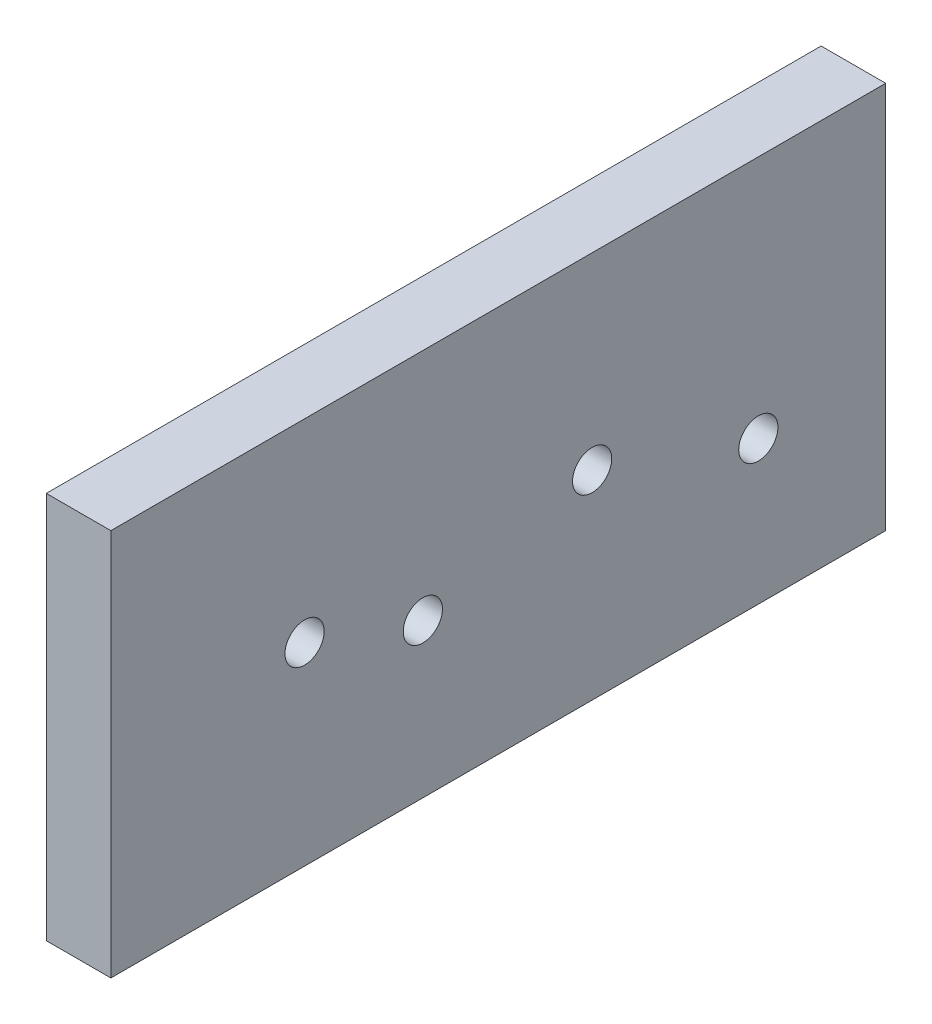
ISO-10303-21;
HEADER;
FILE_DESCRIPTION(('STEP AP214'),'2;1');
FILE_NAME('part.step','',(''),(''),'','','');
FILE_SCHEMA(('AUTOMOTIVE_DESIGN { 1 0 10303 214 1 1 1 1 }'));
ENDSEC;
DATA;
#1=APPLICATION_CONTEXT('core data for automotive mechanical design processes');
#2=APPLICATION_PROTOCOL_DEFINITION('international standard','automotive_design',2000,#1);
#3=PRODUCT_CONTEXT('',#1,'mechanical');
#4=PRODUCT('Part','Part','',(#3));
#5=PRODUCT_RELATED_PRODUCT_CATEGORY('part','',(#4));
#6=PRODUCT_DEFINITION_FORMATION('','',#4);
#7=PRODUCT_DEFINITION_CONTEXT('part definition',#1,'design');
#8=PRODUCT_DEFINITION('design','',#6,#7);
#9=PRODUCT_DEFINITION_SHAPE('','',#8);
#10=(LENGTH_UNIT() NAMED_UNIT(*) SI_UNIT(.MILLI.,.METRE.));
#11=(NAMED_UNIT(*) PLANE_ANGLE_UNIT() SI_UNIT($,.RADIAN.));
#12=(NAMED_UNIT(*) SI_UNIT($,.STERADIAN.) SOLID_ANGLE_UNIT());
#13=UNCERTAINTY_MEASURE_WITH_UNIT(LENGTH_MEASURE(1.E-05),#10,'distance_accuracy_value','');
#14=(GEOMETRIC_REPRESENTATION_CONTEXT(3) GLOBAL_UNCERTAINTY_ASSIGNED_CONTEXT((#13)) GLOBAL_UNIT_ASSIGNED_CONTEXT((#10,
#11,#12)) REPRESENTATION_CONTEXT('',''));
#15=CARTESIAN_POINT('',(0.,0.,0.));
#16=DIRECTION('',(0.,0.,1.));
#17=DIRECTION('',(1.,0.,0.));
#18=AXIS2_PLACEMENT_3D('',#15,#16,#17);
#19=CARTESIAN_POINT('',(12.7,-9.873506971,-51.1434579937716));
#20=DIRECTION('',(-1.,0.,0.));
#21=DIRECTION('',(0.,0.,1.));
#22=AXIS2_PLACEMENT_3D('',#19,#20,#21);
#23=CYLINDRICAL_SURFACE('',#22,3.85455777521835);
#24=CARTESIAN_POINT('',(12.7,-9.873506971,-51.1434579937716));
#25=DIRECTION('',(1.,0.,0.));
#26=DIRECTION('',(0.,0.,-1.));
#27=AXIS2_PLACEMENT_3D('',#24,#25,#26);
#28=CIRCLE('',#27,3.85455777521835);
#29=CARTESIAN_POINT('',(12.7,-9.873506971,-54.99801576899));
#30=VERTEX_POINT('',#29);
#31=EDGE_CURVE('E162',#30,#30,#28,.T.);
#32=ORIENTED_EDGE('',*,*,#31,.T.);
#33=EDGE_LOOP('',(#32));
#34=FACE_BOUND('',#33,.T.);
#35=CARTESIAN_POINT('',(4.7625,-9.873506971,-51.1434579937716));
#36=DIRECTION('',(-1.,0.,0.));
#37=DIRECTION('',(0.,0.,1.));
#38=AXIS2_PLACEMENT_3D('',#35,#36,#37);
#39=CIRCLE('',#38,3.85455777521835);
#40=CARTESIAN_POINT('',(4.7625,-9.873506971,-47.2889002185533));
#41=VERTEX_POINT('',#40);
#42=EDGE_CURVE('E53',#41,#41,#39,.T.);
#43=ORIENTED_EDGE('',*,*,#42,.T.);
#44=EDGE_LOOP('',(#43));
#45=FACE_BOUND('',#44,.T.);
#46=ADVANCED_FACE('F49',(#34,#45),#23,.F.);
#47=CARTESIAN_POINT('',(12.7,1.096077429,-18.4577335821185));
#48=DIRECTION('',(-1.,0.,0.));
#49=DIRECTION('',(0.,0.,1.));
#50=AXIS2_PLACEMENT_3D('',#47,#48,#49);
#51=CYLINDRICAL_SURFACE('',#50,3.85455777521835);
#52=CARTESIAN_POINT('',(12.7,1.096077429,-18.4577335821185));
#53=DIRECTION('',(1.,0.,0.));
#54=DIRECTION('',(0.,0.,-1.));
#55=AXIS2_PLACEMENT_3D('',#52,#53,#54);
#56=CIRCLE('',#55,3.85455777521835);
#57=CARTESIAN_POINT('',(12.7,1.096077429,-22.3122913573368));
#58=VERTEX_POINT('',#57);
#59=EDGE_CURVE('E158',#58,#58,#56,.T.);
#60=ORIENTED_EDGE('',*,*,#59,.T.);
#61=EDGE_LOOP('',(#60));
#62=FACE_BOUND('',#61,.T.);
#63=CARTESIAN_POINT('',(4.7625,1.096077429,-18.4577335821185));
#64=DIRECTION('',(-1.,0.,0.));
#65=DIRECTION('',(0.,0.,1.));
#66=AXIS2_PLACEMENT_3D('',#63,#64,#65);
#67=CIRCLE('',#66,3.85455777521835);
#68=CARTESIAN_POINT('',(4.7625,1.096077429,-14.6031758069001));
#69=VERTEX_POINT('',#68);
#70=EDGE_CURVE('E197',#69,#69,#67,.T.);
#71=ORIENTED_EDGE('',*,*,#70,.T.);
#72=EDGE_LOOP('',(#71));
#73=FACE_BOUND('',#72,.T.);
#74=ADVANCED_FACE('F285',(#62,#73),#51,.F.);
#75=CARTESIAN_POINT('',(12.7,0.,38.1));
#76=DIRECTION('',(-1.,0.,0.));
#77=DIRECTION('',(0.,0.,1.));
#78=AXIS2_PLACEMENT_3D('',#75,#76,#77);
#79=CYLINDRICAL_SURFACE('',#78,3.85455777521835);
#80=CARTESIAN_POINT('',(12.7,0.,38.1));
#81=DIRECTION('',(1.,0.,0.));
#82=DIRECTION('',(0.,0.,-1.));
#83=AXIS2_PLACEMENT_3D('',#80,#81,#82);
#84=CIRCLE('',#83,3.85455777521835);
#85=CARTESIAN_POINT('',(12.7,0.,34.2454422247817));
#86=VERTEX_POINT('',#85);
#87=EDGE_CURVE('E154',#86,#86,#84,.T.);
#88=ORIENTED_EDGE('',*,*,#87,.T.);
#89=EDGE_LOOP('',(#88));
#90=FACE_BOUND('',#89,.T.);
#91=CARTESIAN_POINT('',(4.7625,0.,38.1));
#92=DIRECTION('',(-1.,0.,0.));
#93=DIRECTION('',(0.,0.,1.));
#94=AXIS2_PLACEMENT_3D('',#91,#92,#93);
#95=CIRCLE('',#94,3.85455777521835);
#96=CARTESIAN_POINT('',(4.7625,0.,41.9545577752184));
#97=VERTEX_POINT('',#96);
#98=EDGE_CURVE('E193',#97,#97,#95,.T.);
#99=ORIENTED_EDGE('',*,*,#98,.T.);
#100=EDGE_LOOP('',(#99));
#101=FACE_BOUND('',#100,.T.);
#102=ADVANCED_FACE('F292',(#90,#101),#79,.F.);
#103=CARTESIAN_POINT('',(12.7,-7.860160654,14.8360220129459));
#104=DIRECTION('',(-1.,0.,0.));
#105=DIRECTION('',(0.,0.,1.));
#106=AXIS2_PLACEMENT_3D('',#103,#104,#105);
#107=CYLINDRICAL_SURFACE('',#106,3.85455777521835);
#108=CARTESIAN_POINT('',(12.7,-7.860160654,14.8360220129459));
#109=DIRECTION('',(1.,0.,0.));
#110=DIRECTION('',(0.,0.,-1.));
#111=AXIS2_PLACEMENT_3D('',#108,#109,#110);
#112=CIRCLE('',#111,3.85455777521835);
#113=CARTESIAN_POINT('',(12.7,-7.860160654,10.9814642377276));
#114=VERTEX_POINT('',#113);
#115=EDGE_CURVE('E166',#114,#114,#112,.T.);
#116=ORIENTED_EDGE('',*,*,#115,.T.);
#117=EDGE_LOOP('',(#116));
#118=FACE_BOUND('',#117,.T.);
#119=CARTESIAN_POINT('',(4.7625,-7.860160654,14.8360220129459));
#120=DIRECTION('',(-1.,0.,0.));
#121=DIRECTION('',(0.,0.,1.));
#122=AXIS2_PLACEMENT_3D('',#119,#120,#121);
#123=CIRCLE('',#122,3.85455777521835);
#124=CARTESIAN_POINT('',(4.7625,-7.860160654,18.6905797881643));
#125=VERTEX_POINT('',#124);
#126=EDGE_CURVE('E189',#125,#125,#123,.T.);
#127=ORIENTED_EDGE('',*,*,#126,.T.);
#128=EDGE_LOOP('',(#127));
#129=FACE_BOUND('',#128,.T.);
#130=ADVANCED_FACE('F296',(#118,#129),#107,.F.);
#131=CARTESIAN_POINT('',(12.7,-38.1,0.));
#132=DIRECTION('',(0.,1.,0.));
#133=DIRECTION('',(0.,0.,1.));
#134=AXIS2_PLACEMENT_3D('',#131,#132,#133);
#135=PLANE('',#134);
#136=CARTESIAN_POINT('',(6.35000000000002,-38.1,-63.5));
#137=DIRECTION('',(0.,-1.,0.));
#138=DIRECTION('',(0.,0.,-1.));
#139=AXIS2_PLACEMENT_3D('',#136,#137,#138);
#140=CIRCLE('',#139,3.17499999999999);
#141=CARTESIAN_POINT('',(6.35000000000002,-38.1,-66.675));
#142=VERTEX_POINT('',#141);
#143=EDGE_CURVE('E118',#142,#142,#140,.T.);
#144=ORIENTED_EDGE('',*,*,#143,.F.);
#145=EDGE_LOOP('',(#144));
#146=FACE_BOUND('',#145,.T.);
#147=CARTESIAN_POINT('',(6.35000000000001,-38.1,0.));
#148=DIRECTION('',(0.,-1.,0.));
#149=DIRECTION('',(0.,0.,-1.));
#150=AXIS2_PLACEMENT_3D('',#147,#148,#149);
#151=CIRCLE('',#150,3.17499999999999);
#152=CARTESIAN_POINT('',(6.35000000000001,-38.1,-3.17499999999997));
#153=VERTEX_POINT('',#152);
#154=EDGE_CURVE('E117',#153,#153,#151,.T.);
#155=ORIENTED_EDGE('',*,*,#154,.F.);
#156=EDGE_LOOP('',(#155));
#157=FACE_BOUND('',#156,.T.);
#158=CARTESIAN_POINT('',(6.35,-38.1,57.15));
#159=DIRECTION('',(0.,-1.,0.));
#160=DIRECTION('',(0.,0.,-1.));
#161=AXIS2_PLACEMENT_3D('',#158,#159,#160);
#162=CIRCLE('',#161,3.17499999999999);
#163=CARTESIAN_POINT('',(6.35,-38.1,53.975));
#164=VERTEX_POINT('',#163);
#165=EDGE_CURVE('E132',#164,#164,#162,.T.);
#166=ORIENTED_EDGE('',*,*,#165,.F.);
#167=EDGE_LOOP('',(#166));
#168=FACE_BOUND('',#167,.T.);
#169=DIRECTION('',(0.,0.,-1.));
#170=VECTOR('',#169,1.);
#171=CARTESIAN_POINT('',(0.,-38.1,0.));
#172=LINE('',#171,#170);
#173=CARTESIAN_POINT('',(0.,-38.1,76.2));
#174=VERTEX_POINT('',#173);
#175=CARTESIAN_POINT('',(0.,-38.1,-76.2));
#176=VERTEX_POINT('',#175);
#177=EDGE_CURVE('E140',#174,#176,#172,.T.);
#178=ORIENTED_EDGE('',*,*,#177,.T.);
#179=DIRECTION('',(-1.,0.,0.));
#180=VECTOR('',#179,1.);
#181=CARTESIAN_POINT('',(12.7,-38.1,-76.2));
#182=LINE('',#181,#180);
#183=CARTESIAN_POINT('',(12.7,-38.1,-76.2));
#184=VERTEX_POINT('',#183);
#185=EDGE_CURVE('E11',#184,#176,#182,.T.);
#186=ORIENTED_EDGE('',*,*,#185,.F.);
#187=DIRECTION('',(0.,0.,-1.));
#188=VECTOR('',#187,1.);
#189=CARTESIAN_POINT('',(12.7,-38.1,0.));
#190=LINE('',#189,#188);
#191=CARTESIAN_POINT('',(12.7,-38.1,76.2));
#192=VERTEX_POINT('',#191);
#193=EDGE_CURVE('E141',#192,#184,#190,.T.);
#194=ORIENTED_EDGE('',*,*,#193,.F.);
#195=DIRECTION('',(-1.,0.,0.));
#196=VECTOR('',#195,1.);
#197=CARTESIAN_POINT('',(12.7,-38.1,76.2));
#198=LINE('',#197,#196);
#199=EDGE_CURVE('E69',#192,#174,#198,.T.);
#200=ORIENTED_EDGE('',*,*,#199,.T.);
#201=EDGE_LOOP('',(#178,#186,#194,#200));
#202=FACE_BOUND('',#201,.T.);
#203=ADVANCED_FACE('F51',(#146,#157,#168,#202),#135,.F.);
#204=CARTESIAN_POINT('',(12.7,0.,-76.2));
#205=DIRECTION('',(0.,0.,1.));
#206=DIRECTION('',(1.,0.,0.));
#207=AXIS2_PLACEMENT_3D('',#204,#205,#206);
#208=PLANE('',#207);
#209=DIRECTION('',(0.,1.,0.));
#210=VECTOR('',#209,1.);
#211=CARTESIAN_POINT('',(0.,0.,-76.2));
#212=LINE('',#211,#210);
#213=CARTESIAN_POINT('',(0.,38.1,-76.2));
#214=VERTEX_POINT('',#213);
#215=EDGE_CURVE('E172',#176,#214,#212,.T.);
#216=ORIENTED_EDGE('',*,*,#215,.T.);
#217=DIRECTION('',(-1.,0.,0.));
#218=VECTOR('',#217,1.);
#219=CARTESIAN_POINT('',(12.7,38.1,-76.2));
#220=LINE('',#219,#218);
#221=CARTESIAN_POINT('',(12.7,38.1,-76.2));
#222=VERTEX_POINT('',#221);
#223=EDGE_CURVE('E60',#222,#214,#220,.T.);
#224=ORIENTED_EDGE('',*,*,#223,.F.);
#225=DIRECTION('',(0.,1.,0.));
#226=VECTOR('',#225,1.);
#227=CARTESIAN_POINT('',(12.7,0.,-76.2));
#228=LINE('',#227,#226);
#229=EDGE_CURVE('E95',#184,#222,#228,.T.);
#230=ORIENTED_EDGE('',*,*,#229,.F.);
#231=ORIENTED_EDGE('',*,*,#185,.T.);
#232=EDGE_LOOP('',(#216,#224,#230,#231));
#233=FACE_BOUND('',#232,.T.);
#234=ADVANCED_FACE('F280',(#233),#208,.F.);
#235=CARTESIAN_POINT('',(12.7,38.1,0.));
#236=DIRECTION('',(0.,1.,0.));
#237=DIRECTION('',(0.,0.,1.));
#238=AXIS2_PLACEMENT_3D('',#235,#236,#237);
#239=PLANE('',#238);
#240=DIRECTION('',(0.,0.,-1.));
#241=VECTOR('',#240,1.);
#242=CARTESIAN_POINT('',(0.,38.1,0.));
#243=LINE('',#242,#241);
#244=CARTESIAN_POINT('',(0.,38.1,76.2));
#245=VERTEX_POINT('',#244);
#246=EDGE_CURVE('E176',#245,#214,#243,.T.);
#247=ORIENTED_EDGE('',*,*,#246,.F.);
#248=DIRECTION('',(-1.,0.,0.));
#249=VECTOR('',#248,1.);
#250=CARTESIAN_POINT('',(12.7,38.1,76.2));
#251=LINE('',#250,#249);
#252=CARTESIAN_POINT('',(12.7,38.1,76.2));
#253=VERTEX_POINT('',#252);
#254=EDGE_CURVE('E84',#253,#245,#251,.T.);
#255=ORIENTED_EDGE('',*,*,#254,.F.);
#256=DIRECTION('',(0.,0.,-1.));
#257=VECTOR('',#256,1.);
#258=CARTESIAN_POINT('',(12.7,38.1,0.));
#259=LINE('',#258,#257);
#260=EDGE_CURVE('E147',#253,#222,#259,.T.);
#261=ORIENTED_EDGE('',*,*,#260,.T.);
#262=ORIENTED_EDGE('',*,*,#223,.T.);
#263=EDGE_LOOP('',(#247,#255,#261,#262));
#264=FACE_BOUND('',#263,.T.);
#265=ADVANCED_FACE('F271',(#264),#239,.T.);
#266=CARTESIAN_POINT('',(12.7,0.,76.2));
#267=DIRECTION('',(0.,0.,1.));
#268=DIRECTION('',(1.,0.,0.));
#269=AXIS2_PLACEMENT_3D('',#266,#267,#268);
#270=PLANE('',#269);
#271=DIRECTION('',(0.,1.,0.));
#272=VECTOR('',#271,1.);
#273=CARTESIAN_POINT('',(0.,0.,76.2));
#274=LINE('',#273,#272);
#275=EDGE_CURVE('E144',#174,#245,#274,.T.);
#276=ORIENTED_EDGE('',*,*,#275,.F.);
#277=ORIENTED_EDGE('',*,*,#199,.F.);
#278=DIRECTION('',(0.,1.,0.));
#279=VECTOR('',#278,1.);
#280=CARTESIAN_POINT('',(12.7,0.,76.2));
#281=LINE('',#280,#279);
#282=EDGE_CURVE('E151',#192,#253,#281,.T.);
#283=ORIENTED_EDGE('',*,*,#282,.T.);
#284=ORIENTED_EDGE('',*,*,#254,.T.);
#285=EDGE_LOOP('',(#276,#277,#283,#284));
#286=FACE_BOUND('',#285,.T.);
#287=ADVANCED_FACE('F269',(#286),#270,.T.);
#288=CARTESIAN_POINT('',(12.7,0.,0.));
#289=DIRECTION('',(1.,0.,0.));
#290=DIRECTION('',(0.,0.,-1.));
#291=AXIS2_PLACEMENT_3D('',#288,#289,#290);
#292=PLANE('',#291);
#293=ORIENTED_EDGE('',*,*,#193,.T.);
#294=ORIENTED_EDGE('',*,*,#229,.T.);
#295=ORIENTED_EDGE('',*,*,#260,.F.);
#296=ORIENTED_EDGE('',*,*,#282,.F.);
#297=EDGE_LOOP('',(#293,#294,#295,#296));
#298=FACE_BOUND('',#297,.T.);
#299=ORIENTED_EDGE('',*,*,#87,.F.);
#300=EDGE_LOOP('',(#299));
#301=FACE_BOUND('',#300,.T.);
#302=ORIENTED_EDGE('',*,*,#59,.F.);
#303=EDGE_LOOP('',(#302));
#304=FACE_BOUND('',#303,.T.);
#305=ORIENTED_EDGE('',*,*,#31,.F.);
#306=EDGE_LOOP('',(#305));
#307=FACE_BOUND('',#306,.T.);
#308=ORIENTED_EDGE('',*,*,#115,.F.);
#309=EDGE_LOOP('',(#308));
#310=FACE_BOUND('',#309,.T.);
#311=ADVANCED_FACE('F260',(#298,#301,#304,#307,#310),#292,.T.);
#312=CARTESIAN_POINT('',(0.,0.,0.));
#313=DIRECTION('',(1.,0.,0.));
#314=DIRECTION('',(0.,0.,-1.));
#315=AXIS2_PLACEMENT_3D('',#312,#313,#314);
#316=PLANE('',#315);
#317=CARTESIAN_POINT('',(0.,0.,38.1));
#318=DIRECTION('',(-1.,0.,0.));
#319=DIRECTION('',(0.,0.,1.));
#320=AXIS2_PLACEMENT_3D('',#317,#318,#319);
#321=CIRCLE('',#320,6.1595);
#322=CARTESIAN_POINT('',(0.,0.,44.2595));
#323=VERTEX_POINT('',#322);
#324=EDGE_CURVE('E239',#323,#323,#321,.T.);
#325=ORIENTED_EDGE('',*,*,#324,.F.);
#326=EDGE_LOOP('',(#325));
#327=FACE_BOUND('',#326,.T.);
#328=CARTESIAN_POINT('',(0.,-7.860160654,14.8360220129459));
#329=DIRECTION('',(-1.,0.,0.));
#330=DIRECTION('',(0.,0.,1.));
#331=AXIS2_PLACEMENT_3D('',#328,#329,#330);
#332=CIRCLE('',#331,6.1595);
#333=CARTESIAN_POINT('',(0.,-7.860160654,20.9955220129459));
#334=VERTEX_POINT('',#333);
#335=EDGE_CURVE('E235',#334,#334,#332,.T.);
#336=ORIENTED_EDGE('',*,*,#335,.F.);
#337=EDGE_LOOP('',(#336));
#338=FACE_BOUND('',#337,.T.);
#339=CARTESIAN_POINT('',(0.,1.096077429,-18.4577335821185));
#340=DIRECTION('',(-1.,0.,0.));
#341=DIRECTION('',(0.,0.,1.));
#342=AXIS2_PLACEMENT_3D('',#339,#340,#341);
#343=CIRCLE('',#342,6.1595);
#344=CARTESIAN_POINT('',(0.,1.096077429,-12.2982335821185));
#345=VERTEX_POINT('',#344);
#346=EDGE_CURVE('E227',#345,#345,#343,.T.);
#347=ORIENTED_EDGE('',*,*,#346,.F.);
#348=EDGE_LOOP('',(#347));
#349=FACE_BOUND('',#348,.T.);
#350=CARTESIAN_POINT('',(0.,-9.873506971,-51.1434579937716));
#351=DIRECTION('',(-1.,0.,0.));
#352=DIRECTION('',(0.,0.,1.));
#353=AXIS2_PLACEMENT_3D('',#350,#351,#352);
#354=CIRCLE('',#353,6.1595);
#355=CARTESIAN_POINT('',(0.,-9.873506971,-44.9839579937716));
#356=VERTEX_POINT('',#355);
#357=EDGE_CURVE('E218',#356,#356,#354,.T.);
#358=ORIENTED_EDGE('',*,*,#357,.F.);
#359=EDGE_LOOP('',(#358));
#360=FACE_BOUND('',#359,.T.);
#361=ORIENTED_EDGE('',*,*,#177,.F.);
#362=ORIENTED_EDGE('',*,*,#275,.T.);
#363=ORIENTED_EDGE('',*,*,#246,.T.);
#364=ORIENTED_EDGE('',*,*,#215,.F.);
#365=EDGE_LOOP('',(#361,#362,#363,#364));
#366=FACE_BOUND('',#365,.T.);
#367=ADVANCED_FACE('F256',(#327,#338,#349,#360,#366),#316,.F.);
#368=CARTESIAN_POINT('',(6.35,0.,57.15));
#369=DIRECTION('',(0.,-1.,0.));
#370=DIRECTION('',(0.,0.,-1.));
#371=AXIS2_PLACEMENT_3D('',#368,#369,#370);
#372=CONICAL_SURFACE('',#371,3.17499999999999,1.02974425867665);
#373=CARTESIAN_POINT('',(6.34999999999999,1.9077324654125,57.15));
#374=VERTEX_POINT('',#373);
#375=VERTEX_LOOP('',#374);
#376=FACE_BOUND('',#375,.T.);
#377=CARTESIAN_POINT('',(6.35,0.,57.15));
#378=DIRECTION('',(0.,-1.,0.));
#379=DIRECTION('',(0.,0.,-1.));
#380=AXIS2_PLACEMENT_3D('',#377,#378,#379);
#381=CIRCLE('',#380,3.17499999999999);
#382=CARTESIAN_POINT('',(6.35,0.,53.975));
#383=VERTEX_POINT('',#382);
#384=EDGE_CURVE('E136',#383,#383,#381,.T.);
#385=ORIENTED_EDGE('',*,*,#384,.T.);
#386=EDGE_LOOP('',(#385));
#387=FACE_BOUND('',#386,.T.);
#388=ADVANCED_FACE('F259',(#376,#387),#372,.F.);
#389=CARTESIAN_POINT('',(6.35,-38.1,57.15));
#390=DIRECTION('',(0.,-1.,0.));
#391=DIRECTION('',(0.,0.,-1.));
#392=AXIS2_PLACEMENT_3D('',#389,#390,#391);
#393=CYLINDRICAL_SURFACE('',#392,3.17499999999999);
#394=ORIENTED_EDGE('',*,*,#384,.F.);
#395=EDGE_LOOP('',(#394));
#396=FACE_BOUND('',#395,.T.);
#397=ORIENTED_EDGE('',*,*,#165,.T.);
#398=EDGE_LOOP('',(#397));
#399=FACE_BOUND('',#398,.T.);
#400=ADVANCED_FACE('F335',(#396,#399),#393,.F.);
#401=CARTESIAN_POINT('',(6.35000000000001,0.,0.));
#402=DIRECTION('',(0.,-1.,0.));
#403=DIRECTION('',(0.,0.,-1.));
#404=AXIS2_PLACEMENT_3D('',#401,#402,#403);
#405=CONICAL_SURFACE('',#404,3.17499999999999,1.02974425867665);
#406=CARTESIAN_POINT('',(6.35,1.9077324654125,0.));
#407=VERTEX_POINT('',#406);
#408=VERTEX_LOOP('',#407);
#409=FACE_BOUND('',#408,.T.);
#410=CARTESIAN_POINT('',(6.35000000000001,0.,0.));
#411=DIRECTION('',(0.,-1.,0.));
#412=DIRECTION('',(0.,0.,-1.));
#413=AXIS2_PLACEMENT_3D('',#410,#411,#412);
#414=CIRCLE('',#413,3.17499999999999);
#415=CARTESIAN_POINT('',(6.35000000000001,0.,-3.17499999999998));
#416=VERTEX_POINT('',#415);
#417=EDGE_CURVE('E123',#416,#416,#414,.T.);
#418=ORIENTED_EDGE('',*,*,#417,.T.);
#419=EDGE_LOOP('',(#418));
#420=FACE_BOUND('',#419,.T.);
#421=ADVANCED_FACE('F331',(#409,#420),#405,.F.);
#422=CARTESIAN_POINT('',(6.35000000000001,-38.1,0.));
#423=DIRECTION('',(0.,-1.,0.));
#424=DIRECTION('',(0.,0.,-1.));
#425=AXIS2_PLACEMENT_3D('',#422,#423,#424);
#426=CYLINDRICAL_SURFACE('',#425,3.17499999999999);
#427=ORIENTED_EDGE('',*,*,#417,.F.);
#428=EDGE_LOOP('',(#427));
#429=FACE_BOUND('',#428,.T.);
#430=ORIENTED_EDGE('',*,*,#154,.T.);
#431=EDGE_LOOP('',(#430));
#432=FACE_BOUND('',#431,.T.);
#433=ADVANCED_FACE('F110',(#429,#432),#426,.F.);
#434=CARTESIAN_POINT('',(6.35000000000002,0.,-63.5));
#435=DIRECTION('',(0.,-1.,0.));
#436=DIRECTION('',(0.,0.,-1.));
#437=AXIS2_PLACEMENT_3D('',#434,#435,#436);
#438=CONICAL_SURFACE('',#437,3.17499999999999,1.02974425867665);
#439=CARTESIAN_POINT('',(6.35000000000001,1.9077324654125,-63.5));
#440=VERTEX_POINT('',#439);
#441=VERTEX_LOOP('',#440);
#442=FACE_BOUND('',#441,.T.);
#443=CARTESIAN_POINT('',(6.35000000000002,0.,-63.5));
#444=DIRECTION('',(0.,-1.,0.));
#445=DIRECTION('',(0.,0.,-1.));
#446=AXIS2_PLACEMENT_3D('',#443,#444,#445);
#447=CIRCLE('',#446,3.17499999999999);
#448=CARTESIAN_POINT('',(6.35000000000002,0.,-66.675));
#449=VERTEX_POINT('',#448);
#450=EDGE_CURVE('E114',#449,#449,#447,.T.);
#451=ORIENTED_EDGE('',*,*,#450,.T.);
#452=EDGE_LOOP('',(#451));
#453=FACE_BOUND('',#452,.T.);
#454=ADVANCED_FACE('F106',(#442,#453),#438,.F.);
#455=CARTESIAN_POINT('',(6.35000000000002,-38.1,-63.5));
#456=DIRECTION('',(0.,-1.,0.));
#457=DIRECTION('',(0.,0.,-1.));
#458=AXIS2_PLACEMENT_3D('',#455,#456,#457);
#459=CYLINDRICAL_SURFACE('',#458,3.17499999999999);
#460=ORIENTED_EDGE('',*,*,#450,.F.);
#461=EDGE_LOOP('',(#460));
#462=FACE_BOUND('',#461,.T.);
#463=ORIENTED_EDGE('',*,*,#143,.T.);
#464=EDGE_LOOP('',(#463));
#465=FACE_BOUND('',#464,.T.);
#466=ADVANCED_FACE('F109',(#462,#465),#459,.F.);
#467=CARTESIAN_POINT('',(4.7625,-9.873506971,-51.1434579937716));
#468=DIRECTION('',(-1.,0.,0.));
#469=DIRECTION('',(0.,0.,1.));
#470=AXIS2_PLACEMENT_3D('',#467,#468,#469);
#471=CYLINDRICAL_SURFACE('',#470,6.1595);
#472=CARTESIAN_POINT('',(4.7625,-9.873506971,-51.1434579937716));
#473=DIRECTION('',(-1.,0.,0.));
#474=DIRECTION('',(0.,0.,1.));
#475=AXIS2_PLACEMENT_3D('',#472,#473,#474);
#476=CIRCLE('',#475,6.1595);
#477=CARTESIAN_POINT('',(4.7625,-9.873506971,-44.9839579937716));
#478=VERTEX_POINT('',#477);
#479=EDGE_CURVE('E215',#478,#478,#476,.T.);
#480=CARTESIAN_POINT('',(4.7625,-9.873506971,-44.9839579937716));
#481=CARTESIAN_POINT('',(4.712890625,-9.873506971,-44.9839579937716));
#482=CARTESIAN_POINT('',(4.66328125,-9.873506971,-44.9839579937716));
#483=CARTESIAN_POINT('',(4.5640625,-9.873506971,-44.9839579937716));
#484=CARTESIAN_POINT('',(4.514453125,-9.873506971,-44.9839579937716));
#485=CARTESIAN_POINT('',(4.415234375,-9.873506971,-44.9839579937716));
#486=CARTESIAN_POINT('',(4.365625,-9.873506971,-44.9839579937716));
#487=CARTESIAN_POINT('',(4.26640625,-9.873506971,-44.9839579937716));
#488=CARTESIAN_POINT('',(4.216796875,-9.873506971,-44.9839579937716));
#489=CARTESIAN_POINT('',(4.117578125,-9.873506971,-44.9839579937716));
#490=CARTESIAN_POINT('',(4.06796875,-9.873506971,-44.9839579937716));
#491=CARTESIAN_POINT('',(3.96875,-9.873506971,-44.9839579937716));
#492=CARTESIAN_POINT('',(3.919140625,-9.873506971,-44.9839579937716));
#493=CARTESIAN_POINT('',(3.819921875,-9.873506971,-44.9839579937716));
#494=CARTESIAN_POINT('',(3.7703125,-9.873506971,-44.9839579937716));
#495=CARTESIAN_POINT('',(3.67109375,-9.873506971,-44.9839579937716));
#496=CARTESIAN_POINT('',(3.621484375,-9.873506971,-44.9839579937716));
#497=CARTESIAN_POINT('',(3.522265625,-9.873506971,-44.9839579937716));
#498=CARTESIAN_POINT('',(3.47265625,-9.873506971,-44.9839579937716));
#499=CARTESIAN_POINT('',(3.3734375,-9.873506971,-44.9839579937716));
#500=CARTESIAN_POINT('',(3.323828125,-9.873506971,-44.9839579937716));
#501=CARTESIAN_POINT('',(3.224609375,-9.873506971,-44.9839579937716));
#502=CARTESIAN_POINT('',(3.175,-9.873506971,-44.9839579937716));
#503=CARTESIAN_POINT('',(3.07578125,-9.873506971,-44.9839579937716));
#504=CARTESIAN_POINT('',(3.026171875,-9.873506971,-44.9839579937716));
#505=CARTESIAN_POINT('',(2.926953125,-9.873506971,-44.9839579937716));
#506=CARTESIAN_POINT('',(2.87734375,-9.873506971,-44.9839579937716));
#507=CARTESIAN_POINT('',(2.778125,-9.873506971,-44.9839579937716));
#508=CARTESIAN_POINT('',(2.728515625,-9.873506971,-44.9839579937716));
#509=CARTESIAN_POINT('',(2.629296875,-9.873506971,-44.9839579937716));
#510=CARTESIAN_POINT('',(2.5796875,-9.873506971,-44.9839579937716));
#511=CARTESIAN_POINT('',(2.48046875,-9.873506971,-44.9839579937716));
#512=CARTESIAN_POINT('',(2.430859375,-9.873506971,-44.9839579937716));
#513=CARTESIAN_POINT('',(2.331640625,-9.873506971,-44.9839579937716));
#514=CARTESIAN_POINT('',(2.28203125,-9.873506971,-44.9839579937716));
#515=CARTESIAN_POINT('',(2.1828125,-9.873506971,-44.9839579937716));
#516=CARTESIAN_POINT('',(2.133203125,-9.873506971,-44.9839579937716));
#517=CARTESIAN_POINT('',(2.033984375,-9.873506971,-44.9839579937716));
#518=CARTESIAN_POINT('',(1.984375,-9.873506971,-44.9839579937716));
#519=CARTESIAN_POINT('',(1.88515625,-9.873506971,-44.9839579937716));
#520=CARTESIAN_POINT('',(1.835546875,-9.873506971,-44.9839579937716));
#521=CARTESIAN_POINT('',(1.736328125,-9.873506971,-44.9839579937716));
#522=CARTESIAN_POINT('',(1.68671875,-9.873506971,-44.9839579937716));
#523=CARTESIAN_POINT('',(1.5875,-9.873506971,-44.9839579937716));
#524=CARTESIAN_POINT('',(1.537890625,-9.873506971,-44.9839579937716));
#525=CARTESIAN_POINT('',(1.438671875,-9.873506971,-44.9839579937716));
#526=CARTESIAN_POINT('',(1.3890625,-9.873506971,-44.9839579937716));
#527=CARTESIAN_POINT('',(1.28984375,-9.873506971,-44.9839579937716));
#528=CARTESIAN_POINT('',(1.240234375,-9.873506971,-44.9839579937716));
#529=CARTESIAN_POINT('',(1.141015625,-9.873506971,-44.9839579937716));
#530=CARTESIAN_POINT('',(1.09140625,-9.873506971,-44.9839579937716));
#531=CARTESIAN_POINT('',(0.9921875,-9.873506971,-44.9839579937716));
#532=CARTESIAN_POINT('',(0.942578125,-9.873506971,-44.9839579937716));
#533=CARTESIAN_POINT('',(0.843359375,-9.873506971,-44.9839579937716));
#534=CARTESIAN_POINT('',(0.79375,-9.873506971,-44.9839579937716));
#535=CARTESIAN_POINT('',(0.69453125,-9.873506971,-44.9839579937716));
#536=CARTESIAN_POINT('',(0.644921875,-9.873506971,-44.9839579937716));
#537=CARTESIAN_POINT('',(0.545703125,-9.873506971,-44.9839579937716));
#538=CARTESIAN_POINT('',(0.49609375,-9.873506971,-44.9839579937716));
#539=CARTESIAN_POINT('',(0.396875,-9.873506971,-44.9839579937716));
#540=CARTESIAN_POINT('',(0.347265625,-9.873506971,-44.9839579937716));
#541=CARTESIAN_POINT('',(0.248046875,-9.873506971,-44.9839579937716));
#542=CARTESIAN_POINT('',(0.1984375,-9.873506971,-44.9839579937716));
#543=CARTESIAN_POINT('',(0.09921875,-9.873506971,-44.9839579937716));
#544=CARTESIAN_POINT('',(0.049609375,-9.873506971,-44.9839579937716));
#545=CARTESIAN_POINT('',(0.,-9.873506971,-44.9839579937716));
#546=B_SPLINE_CURVE_WITH_KNOTS('',3,(#480,#481,#482,#483,#484,#485,#486,#487,#488,#489,#490,
#491,#492,#493,#494,#495,#496,#497,#498,#499,#500,#501,#502,#503,#504,#505,#506,#507,#508,#509,
#510,#511,#512,#513,#514,#515,#516,#517,#518,#519,#520,#521,#522,#523,#524,#525,#526,#527,#528,
#529,#530,#531,#532,#533,#534,#535,#536,#537,#538,#539,#540,#541,#542,#543,#544,#545),
.UNSPECIFIED.,.F.,.F.,(4,2,2,2,2,2,2,2,2,2,2,2,2,2,2,2,2,2,2,2,2,2,2,2,2,2,2,2,2,2,2,2,4),(0.,
0.148828125,0.29765625,0.446484375,0.5953125,0.744140625,0.892968750000001,1.041796875,1.190625,
1.339453125,1.48828125,1.637109375,1.7859375,1.934765625,2.08359375,2.232421875,2.38125,
2.530078125,2.67890625,2.827734375,2.9765625,3.125390625,3.27421875,3.423046875,3.571875,
3.720703125,3.86953125,4.018359375,4.1671875,4.316015625,4.46484375,4.613671875,4.7625),.UNSPECIFIED.);
#547=EDGE_CURVE('BSEAM211',#478,#356,#546,.T.);
#548=ORIENTED_EDGE('',*,*,#479,.F.);
#549=ORIENTED_EDGE('',*,*,#357,.T.);
#550=ORIENTED_EDGE('',*,*,#547,.T.);
#551=ORIENTED_EDGE('',*,*,#547,.F.);
#552=EDGE_LOOP('',(#548,#550,#549,#551));
#553=FACE_BOUND('',#552,.T.);
#554=ADVANCED_FACE('F211',(#553),#471,.F.);
#555=CARTESIAN_POINT('',(4.7625,-9.873506971,-51.1434579937716));
#556=DIRECTION('',(-1.,0.,0.));
#557=DIRECTION('',(0.,0.,1.));
#558=AXIS2_PLACEMENT_3D('',#555,#556,#557);
#559=PLANE('',#558);
#560=ORIENTED_EDGE('',*,*,#42,.F.);
#561=EDGE_LOOP('',(#560));
#562=FACE_BOUND('',#561,.T.);
#563=ORIENTED_EDGE('',*,*,#479,.T.);
#564=EDGE_LOOP('',(#563));
#565=FACE_BOUND('',#564,.T.);
#566=ADVANCED_FACE('F207',(#562,#565),#559,.T.);
#567=CARTESIAN_POINT('',(4.7625,1.096077429,-18.4577335821185));
#568=DIRECTION('',(-1.,0.,0.));
#569=DIRECTION('',(0.,0.,1.));
#570=AXIS2_PLACEMENT_3D('',#567,#568,#569);
#571=CYLINDRICAL_SURFACE('',#570,6.1595);
#572=CARTESIAN_POINT('',(4.7625,1.096077429,-18.4577335821185));
#573=DIRECTION('',(-1.,0.,0.));
#574=DIRECTION('',(0.,0.,1.));
#575=AXIS2_PLACEMENT_3D('',#572,#573,#574);
#576=CIRCLE('',#575,6.1595);
#577=CARTESIAN_POINT('',(4.7625,1.096077429,-12.2982335821185));
#578=VERTEX_POINT('',#577);
#579=EDGE_CURVE('E221',#578,#578,#576,.T.);
#580=CARTESIAN_POINT('',(4.7625,1.096077429,-12.2982335821185));
#581=CARTESIAN_POINT('',(4.712890625,1.096077429,-12.2982335821185));
#582=CARTESIAN_POINT('',(4.66328125,1.096077429,-12.2982335821185));
#583=CARTESIAN_POINT('',(4.5640625,1.096077429,-12.2982335821185));
#584=CARTESIAN_POINT('',(4.514453125,1.096077429,-12.2982335821185));
#585=CARTESIAN_POINT('',(4.415234375,1.096077429,-12.2982335821185));
#586=CARTESIAN_POINT('',(4.365625,1.096077429,-12.2982335821185));
#587=CARTESIAN_POINT('',(4.26640625,1.096077429,-12.2982335821185));
#588=CARTESIAN_POINT('',(4.216796875,1.096077429,-12.2982335821185));
#589=CARTESIAN_POINT('',(4.117578125,1.096077429,-12.2982335821185));
#590=CARTESIAN_POINT('',(4.06796875,1.096077429,-12.2982335821185));
#591=CARTESIAN_POINT('',(3.96875,1.096077429,-12.2982335821185));
#592=CARTESIAN_POINT('',(3.919140625,1.096077429,-12.2982335821185));
#593=CARTESIAN_POINT('',(3.819921875,1.096077429,-12.2982335821185));
#594=CARTESIAN_POINT('',(3.7703125,1.096077429,-12.2982335821185));
#595=CARTESIAN_POINT('',(3.67109375,1.096077429,-12.2982335821185));
#596=CARTESIAN_POINT('',(3.621484375,1.096077429,-12.2982335821185));
#597=CARTESIAN_POINT('',(3.522265625,1.096077429,-12.2982335821185));
#598=CARTESIAN_POINT('',(3.47265625,1.096077429,-12.2982335821185));
#599=CARTESIAN_POINT('',(3.3734375,1.096077429,-12.2982335821185));
#600=CARTESIAN_POINT('',(3.323828125,1.096077429,-12.2982335821185));
#601=CARTESIAN_POINT('',(3.224609375,1.096077429,-12.2982335821185));
#602=CARTESIAN_POINT('',(3.175,1.096077429,-12.2982335821185));
#603=CARTESIAN_POINT('',(3.07578125,1.096077429,-12.2982335821185));
#604=CARTESIAN_POINT('',(3.026171875,1.096077429,-12.2982335821185));
#605=CARTESIAN_POINT('',(2.926953125,1.096077429,-12.2982335821185));
#606=CARTESIAN_POINT('',(2.87734375,1.096077429,-12.2982335821185));
#607=CARTESIAN_POINT('',(2.778125,1.096077429,-12.2982335821185));
#608=CARTESIAN_POINT('',(2.728515625,1.096077429,-12.2982335821185));
#609=CARTESIAN_POINT('',(2.629296875,1.096077429,-12.2982335821185));
#610=CARTESIAN_POINT('',(2.5796875,1.096077429,-12.2982335821185));
#611=CARTESIAN_POINT('',(2.48046875,1.096077429,-12.2982335821185));
#612=CARTESIAN_POINT('',(2.430859375,1.096077429,-12.2982335821185));
#613=CARTESIAN_POINT('',(2.331640625,1.096077429,-12.2982335821185));
#614=CARTESIAN_POINT('',(2.28203125,1.096077429,-12.2982335821185));
#615=CARTESIAN_POINT('',(2.1828125,1.096077429,-12.2982335821185));
#616=CARTESIAN_POINT('',(2.133203125,1.096077429,-12.2982335821185));
#617=CARTESIAN_POINT('',(2.033984375,1.096077429,-12.2982335821185));
#618=CARTESIAN_POINT('',(1.984375,1.096077429,-12.2982335821185));
#619=CARTESIAN_POINT('',(1.88515625,1.096077429,-12.2982335821185));
#620=CARTESIAN_POINT('',(1.835546875,1.096077429,-12.2982335821185));
#621=CARTESIAN_POINT('',(1.736328125,1.096077429,-12.2982335821185));
#622=CARTESIAN_POINT('',(1.68671875,1.096077429,-12.2982335821185));
#623=CARTESIAN_POINT('',(1.5875,1.096077429,-12.2982335821185));
#624=CARTESIAN_POINT('',(1.537890625,1.096077429,-12.2982335821185));
#625=CARTESIAN_POINT('',(1.438671875,1.096077429,-12.2982335821185));
#626=CARTESIAN_POINT('',(1.3890625,1.096077429,-12.2982335821185));
#627=CARTESIAN_POINT('',(1.28984375,1.096077429,-12.2982335821185));
#628=CARTESIAN_POINT('',(1.240234375,1.096077429,-12.2982335821185));
#629=CARTESIAN_POINT('',(1.141015625,1.096077429,-12.2982335821185));
#630=CARTESIAN_POINT('',(1.09140625,1.096077429,-12.2982335821185));
#631=CARTESIAN_POINT('',(0.9921875,1.096077429,-12.2982335821185));
#632=CARTESIAN_POINT('',(0.942578125,1.096077429,-12.2982335821185));
#633=CARTESIAN_POINT('',(0.843359375,1.096077429,-12.2982335821185));
#634=CARTESIAN_POINT('',(0.79375,1.096077429,-12.2982335821185));
#635=CARTESIAN_POINT('',(0.69453125,1.096077429,-12.2982335821185));
#636=CARTESIAN_POINT('',(0.644921875,1.096077429,-12.2982335821185));
#637=CARTESIAN_POINT('',(0.545703125,1.096077429,-12.2982335821185));
#638=CARTESIAN_POINT('',(0.49609375,1.096077429,-12.2982335821185));
#639=CARTESIAN_POINT('',(0.396875,1.096077429,-12.2982335821185));
#640=CARTESIAN_POINT('',(0.347265625,1.096077429,-12.2982335821185));
#641=CARTESIAN_POINT('',(0.248046875,1.096077429,-12.2982335821185));
#642=CARTESIAN_POINT('',(0.1984375,1.096077429,-12.2982335821185));
#643=CARTESIAN_POINT('',(0.09921875,1.096077429,-12.2982335821185));
#644=CARTESIAN_POINT('',(0.049609375,1.096077429,-12.2982335821185));
#645=CARTESIAN_POINT('',(0.,1.096077429,-12.2982335821185));
#646=B_SPLINE_CURVE_WITH_KNOTS('',3,(#580,#581,#582,#583,#584,#585,#586,#587,#588,#589,#590,
#591,#592,#593,#594,#595,#596,#597,#598,#599,#600,#601,#602,#603,#604,#605,#606,#607,#608,#609,
#610,#611,#612,#613,#614,#615,#616,#617,#618,#619,#620,#621,#622,#623,#624,#625,#626,#627,#628,
#629,#630,#631,#632,#633,#634,#635,#636,#637,#638,#639,#640,#641,#642,#643,#644,#645),
.UNSPECIFIED.,.F.,.F.,(4,2,2,2,2,2,2,2,2,2,2,2,2,2,2,2,2,2,2,2,2,2,2,2,2,2,2,2,2,2,2,2,4),(0.,
0.148828125,0.29765625,0.446484375,0.5953125,0.744140625,0.892968750000001,1.041796875,1.190625,
1.339453125,1.48828125,1.637109375,1.7859375,1.934765625,2.08359375,2.232421875,2.38125,
2.530078125,2.67890625,2.827734375,2.9765625,3.125390625,3.27421875,3.423046875,3.571875,
3.720703125,3.86953125,4.018359375,4.1671875,4.316015625,4.46484375,4.613671875,4.7625),.UNSPECIFIED.);
#647=EDGE_CURVE('BSEAM210',#578,#345,#646,.T.);
#648=ORIENTED_EDGE('',*,*,#579,.F.);
#649=ORIENTED_EDGE('',*,*,#346,.T.);
#650=ORIENTED_EDGE('',*,*,#647,.T.);
#651=ORIENTED_EDGE('',*,*,#647,.F.);
#652=EDGE_LOOP('',(#648,#650,#649,#651));
#653=FACE_BOUND('',#652,.T.);
#654=ADVANCED_FACE('F210',(#653),#571,.F.);
#655=CARTESIAN_POINT('',(4.7625,1.096077429,-18.4577335821185));
#656=DIRECTION('',(-1.,0.,0.));
#657=DIRECTION('',(0.,0.,1.));
#658=AXIS2_PLACEMENT_3D('',#655,#656,#657);
#659=PLANE('',#658);
#660=ORIENTED_EDGE('',*,*,#70,.F.);
#661=EDGE_LOOP('',(#660));
#662=FACE_BOUND('',#661,.T.);
#663=ORIENTED_EDGE('',*,*,#579,.T.);
#664=EDGE_LOOP('',(#663));
#665=FACE_BOUND('',#664,.T.);
#666=ADVANCED_FACE('F315',(#662,#665),#659,.T.);
#667=CARTESIAN_POINT('',(4.7625,-7.860160654,14.8360220129459));
#668=DIRECTION('',(-1.,0.,0.));
#669=DIRECTION('',(0.,0.,1.));
#670=AXIS2_PLACEMENT_3D('',#667,#668,#669);
#671=CYLINDRICAL_SURFACE('',#670,6.1595);
#672=CARTESIAN_POINT('',(4.7625,-7.860160654,14.8360220129459));
#673=DIRECTION('',(-1.,0.,0.));
#674=DIRECTION('',(0.,0.,1.));
#675=AXIS2_PLACEMENT_3D('',#672,#673,#674);
#676=CIRCLE('',#675,6.1595);
#677=CARTESIAN_POINT('',(4.7625,-7.860160654,20.9955220129459));
#678=VERTEX_POINT('',#677);
#679=EDGE_CURVE('E231',#678,#678,#676,.T.);
#680=CARTESIAN_POINT('',(4.7625,-7.860160654,20.9955220129459));
#681=CARTESIAN_POINT('',(4.712890625,-7.860160654,20.9955220129459));
#682=CARTESIAN_POINT('',(4.66328125,-7.860160654,20.9955220129459));
#683=CARTESIAN_POINT('',(4.5640625,-7.860160654,20.9955220129459));
#684=CARTESIAN_POINT('',(4.514453125,-7.860160654,20.9955220129459));
#685=CARTESIAN_POINT('',(4.415234375,-7.860160654,20.9955220129459));
#686=CARTESIAN_POINT('',(4.365625,-7.860160654,20.9955220129459));
#687=CARTESIAN_POINT('',(4.26640625,-7.860160654,20.9955220129459));
#688=CARTESIAN_POINT('',(4.216796875,-7.860160654,20.9955220129459));
#689=CARTESIAN_POINT('',(4.117578125,-7.860160654,20.9955220129459));
#690=CARTESIAN_POINT('',(4.06796875,-7.860160654,20.9955220129459));
#691=CARTESIAN_POINT('',(3.96875,-7.860160654,20.9955220129459));
#692=CARTESIAN_POINT('',(3.919140625,-7.860160654,20.9955220129459));
#693=CARTESIAN_POINT('',(3.819921875,-7.860160654,20.9955220129459));
#694=CARTESIAN_POINT('',(3.7703125,-7.860160654,20.9955220129459));
#695=CARTESIAN_POINT('',(3.67109375,-7.860160654,20.9955220129459));
#696=CARTESIAN_POINT('',(3.621484375,-7.860160654,20.9955220129459));
#697=CARTESIAN_POINT('',(3.522265625,-7.860160654,20.9955220129459));
#698=CARTESIAN_POINT('',(3.47265625,-7.860160654,20.9955220129459));
#699=CARTESIAN_POINT('',(3.3734375,-7.860160654,20.9955220129459));
#700=CARTESIAN_POINT('',(3.323828125,-7.860160654,20.9955220129459));
#701=CARTESIAN_POINT('',(3.224609375,-7.860160654,20.9955220129459));
#702=CARTESIAN_POINT('',(3.175,-7.860160654,20.9955220129459));
#703=CARTESIAN_POINT('',(3.07578125,-7.860160654,20.9955220129459));
#704=CARTESIAN_POINT('',(3.026171875,-7.860160654,20.9955220129459));
#705=CARTESIAN_POINT('',(2.926953125,-7.860160654,20.9955220129459));
#706=CARTESIAN_POINT('',(2.87734375,-7.860160654,20.9955220129459));
#707=CARTESIAN_POINT('',(2.778125,-7.860160654,20.9955220129459));
#708=CARTESIAN_POINT('',(2.728515625,-7.860160654,20.9955220129459));
#709=CARTESIAN_POINT('',(2.629296875,-7.860160654,20.9955220129459));
#710=CARTESIAN_POINT('',(2.5796875,-7.860160654,20.9955220129459));
#711=CARTESIAN_POINT('',(2.48046875,-7.860160654,20.9955220129459));
#712=CARTESIAN_POINT('',(2.430859375,-7.860160654,20.9955220129459));
#713=CARTESIAN_POINT('',(2.331640625,-7.860160654,20.9955220129459));
#714=CARTESIAN_POINT('',(2.28203125,-7.860160654,20.9955220129459));
#715=CARTESIAN_POINT('',(2.1828125,-7.860160654,20.9955220129459));
#716=CARTESIAN_POINT('',(2.133203125,-7.860160654,20.9955220129459));
#717=CARTESIAN_POINT('',(2.033984375,-7.860160654,20.9955220129459));
#718=CARTESIAN_POINT('',(1.984375,-7.860160654,20.9955220129459));
#719=CARTESIAN_POINT('',(1.88515625,-7.860160654,20.9955220129459));
#720=CARTESIAN_POINT('',(1.835546875,-7.860160654,20.9955220129459));
#721=CARTESIAN_POINT('',(1.736328125,-7.860160654,20.9955220129459));
#722=CARTESIAN_POINT('',(1.68671875,-7.860160654,20.9955220129459));
#723=CARTESIAN_POINT('',(1.5875,-7.860160654,20.9955220129459));
#724=CARTESIAN_POINT('',(1.537890625,-7.860160654,20.9955220129459));
#725=CARTESIAN_POINT('',(1.438671875,-7.860160654,20.9955220129459));
#726=CARTESIAN_POINT('',(1.3890625,-7.860160654,20.9955220129459));
#727=CARTESIAN_POINT('',(1.28984375,-7.860160654,20.9955220129459));
#728=CARTESIAN_POINT('',(1.240234375,-7.860160654,20.9955220129459));
#729=CARTESIAN_POINT('',(1.141015625,-7.860160654,20.9955220129459));
#730=CARTESIAN_POINT('',(1.09140625,-7.860160654,20.9955220129459));
#731=CARTESIAN_POINT('',(0.9921875,-7.860160654,20.9955220129459));
#732=CARTESIAN_POINT('',(0.942578125,-7.860160654,20.9955220129459));
#733=CARTESIAN_POINT('',(0.843359375,-7.860160654,20.9955220129459));
#734=CARTESIAN_POINT('',(0.79375,-7.860160654,20.9955220129459));
#735=CARTESIAN_POINT('',(0.69453125,-7.860160654,20.9955220129459));
#736=CARTESIAN_POINT('',(0.644921875,-7.860160654,20.9955220129459));
#737=CARTESIAN_POINT('',(0.545703125,-7.860160654,20.9955220129459));
#738=CARTESIAN_POINT('',(0.49609375,-7.860160654,20.9955220129459));
#739=CARTESIAN_POINT('',(0.396875,-7.860160654,20.9955220129459));
#740=CARTESIAN_POINT('',(0.347265625,-7.860160654,20.9955220129459));
#741=CARTESIAN_POINT('',(0.248046875,-7.860160654,20.9955220129459));
#742=CARTESIAN_POINT('',(0.1984375,-7.860160654,20.9955220129459));
#743=CARTESIAN_POINT('',(0.09921875,-7.860160654,20.9955220129459));
#744=CARTESIAN_POINT('',(0.049609375,-7.860160654,20.9955220129459));
#745=CARTESIAN_POINT('',(0.,-7.860160654,20.9955220129459));
#746=B_SPLINE_CURVE_WITH_KNOTS('',3,(#680,#681,#682,#683,#684,#685,#686,#687,#688,#689,#690,
#691,#692,#693,#694,#695,#696,#697,#698,#699,#700,#701,#702,#703,#704,#705,#706,#707,#708,#709,
#710,#711,#712,#713,#714,#715,#716,#717,#718,#719,#720,#721,#722,#723,#724,#725,#726,#727,#728,
#729,#730,#731,#732,#733,#734,#735,#736,#737,#738,#739,#740,#741,#742,#743,#744,#745),
.UNSPECIFIED.,.F.,.F.,(4,2,2,2,2,2,2,2,2,2,2,2,2,2,2,2,2,2,2,2,2,2,2,2,2,2,2,2,2,2,2,2,4),(0.,
0.148828125,0.29765625,0.446484375,0.5953125,0.744140625,0.892968750000001,1.041796875,1.190625,
1.339453125,1.48828125,1.637109375,1.7859375,1.934765625,2.08359375,2.232421875,2.38125,
2.530078125,2.67890625,2.827734375,2.9765625,3.125390625,3.27421875,3.423046875,3.571875,
3.720703125,3.86953125,4.018359375,4.1671875,4.316015625,4.46484375,4.613671875,4.7625),.UNSPECIFIED.);
#747=EDGE_CURVE('BSEAM312',#678,#334,#746,.T.);
#748=ORIENTED_EDGE('',*,*,#679,.F.);
#749=ORIENTED_EDGE('',*,*,#335,.T.);
#750=ORIENTED_EDGE('',*,*,#747,.T.);
#751=ORIENTED_EDGE('',*,*,#747,.F.);
#752=EDGE_LOOP('',(#748,#750,#749,#751));
#753=FACE_BOUND('',#752,.T.);
#754=ADVANCED_FACE('F312',(#753),#671,.F.);
#755=CARTESIAN_POINT('',(4.7625,-7.860160654,14.8360220129459));
#756=DIRECTION('',(-1.,0.,0.));
#757=DIRECTION('',(0.,0.,1.));
#758=AXIS2_PLACEMENT_3D('',#755,#756,#757);
#759=PLANE('',#758);
#760=ORIENTED_EDGE('',*,*,#126,.F.);
#761=EDGE_LOOP('',(#760));
#762=FACE_BOUND('',#761,.T.);
#763=ORIENTED_EDGE('',*,*,#679,.T.);
#764=EDGE_LOOP('',(#763));
#765=FACE_BOUND('',#764,.T.);
#766=ADVANCED_FACE('F252',(#762,#765),#759,.T.);
#767=CARTESIAN_POINT('',(4.7625,0.,38.1));
#768=DIRECTION('',(-1.,0.,0.));
#769=DIRECTION('',(0.,0.,1.));
#770=AXIS2_PLACEMENT_3D('',#767,#768,#769);
#771=CYLINDRICAL_SURFACE('',#770,6.1595);
#772=CARTESIAN_POINT('',(4.7625,0.,38.1));
#773=DIRECTION('',(-1.,0.,0.));
#774=DIRECTION('',(0.,0.,1.));
#775=AXIS2_PLACEMENT_3D('',#772,#773,#774);
#776=CIRCLE('',#775,6.1595);
#777=CARTESIAN_POINT('',(4.7625,0.,44.2595));
#778=VERTEX_POINT('',#777);
#779=EDGE_CURVE('E194',#778,#778,#776,.T.);
#780=CARTESIAN_POINT('',(4.7625,0.,44.2595));
#781=CARTESIAN_POINT('',(4.712890625,0.,44.2595));
#782=CARTESIAN_POINT('',(4.66328125,0.,44.2595));
#783=CARTESIAN_POINT('',(4.5640625,0.,44.2595));
#784=CARTESIAN_POINT('',(4.514453125,0.,44.2595));
#785=CARTESIAN_POINT('',(4.415234375,0.,44.2595));
#786=CARTESIAN_POINT('',(4.365625,0.,44.2595));
#787=CARTESIAN_POINT('',(4.26640625,0.,44.2595));
#788=CARTESIAN_POINT('',(4.216796875,0.,44.2595));
#789=CARTESIAN_POINT('',(4.117578125,0.,44.2595));
#790=CARTESIAN_POINT('',(4.06796875,0.,44.2595));
#791=CARTESIAN_POINT('',(3.96875,0.,44.2595));
#792=CARTESIAN_POINT('',(3.919140625,0.,44.2595));
#793=CARTESIAN_POINT('',(3.819921875,0.,44.2595));
#794=CARTESIAN_POINT('',(3.7703125,0.,44.2595));
#795=CARTESIAN_POINT('',(3.67109375,0.,44.2595));
#796=CARTESIAN_POINT('',(3.621484375,0.,44.2595));
#797=CARTESIAN_POINT('',(3.522265625,0.,44.2595));
#798=CARTESIAN_POINT('',(3.47265625,0.,44.2595));
#799=CARTESIAN_POINT('',(3.3734375,0.,44.2595));
#800=CARTESIAN_POINT('',(3.323828125,0.,44.2595));
#801=CARTESIAN_POINT('',(3.224609375,0.,44.2595));
#802=CARTESIAN_POINT('',(3.175,0.,44.2595));
#803=CARTESIAN_POINT('',(3.07578125,0.,44.2595));
#804=CARTESIAN_POINT('',(3.026171875,0.,44.2595));
#805=CARTESIAN_POINT('',(2.926953125,0.,44.2595));
#806=CARTESIAN_POINT('',(2.87734375,0.,44.2595));
#807=CARTESIAN_POINT('',(2.778125,0.,44.2595));
#808=CARTESIAN_POINT('',(2.728515625,0.,44.2595));
#809=CARTESIAN_POINT('',(2.629296875,0.,44.2595));
#810=CARTESIAN_POINT('',(2.5796875,0.,44.2595));
#811=CARTESIAN_POINT('',(2.48046875,0.,44.2595));
#812=CARTESIAN_POINT('',(2.430859375,0.,44.2595));
#813=CARTESIAN_POINT('',(2.331640625,0.,44.2595));
#814=CARTESIAN_POINT('',(2.28203125,0.,44.2595));
#815=CARTESIAN_POINT('',(2.1828125,0.,44.2595));
#816=CARTESIAN_POINT('',(2.133203125,0.,44.2595));
#817=CARTESIAN_POINT('',(2.033984375,0.,44.2595));
#818=CARTESIAN_POINT('',(1.984375,0.,44.2595));
#819=CARTESIAN_POINT('',(1.88515625,0.,44.2595));
#820=CARTESIAN_POINT('',(1.835546875,0.,44.2595));
#821=CARTESIAN_POINT('',(1.736328125,0.,44.2595));
#822=CARTESIAN_POINT('',(1.68671875,0.,44.2595));
#823=CARTESIAN_POINT('',(1.5875,0.,44.2595));
#824=CARTESIAN_POINT('',(1.537890625,0.,44.2595));
#825=CARTESIAN_POINT('',(1.438671875,0.,44.2595));
#826=CARTESIAN_POINT('',(1.3890625,0.,44.2595));
#827=CARTESIAN_POINT('',(1.28984375,0.,44.2595));
#828=CARTESIAN_POINT('',(1.240234375,0.,44.2595));
#829=CARTESIAN_POINT('',(1.141015625,0.,44.2595));
#830=CARTESIAN_POINT('',(1.09140625,0.,44.2595));
#831=CARTESIAN_POINT('',(0.9921875,0.,44.2595));
#832=CARTESIAN_POINT('',(0.942578125,0.,44.2595));
#833=CARTESIAN_POINT('',(0.843359375,0.,44.2595));
#834=CARTESIAN_POINT('',(0.79375,0.,44.2595));
#835=CARTESIAN_POINT('',(0.69453125,0.,44.2595));
#836=CARTESIAN_POINT('',(0.644921875,0.,44.2595));
#837=CARTESIAN_POINT('',(0.545703125,0.,44.2595));
#838=CARTESIAN_POINT('',(0.49609375,0.,44.2595));
#839=CARTESIAN_POINT('',(0.396875,0.,44.2595));
#840=CARTESIAN_POINT('',(0.347265625,0.,44.2595));
#841=CARTESIAN_POINT('',(0.248046875,0.,44.2595));
#842=CARTESIAN_POINT('',(0.1984375,0.,44.2595));
#843=CARTESIAN_POINT('',(0.09921875,0.,44.2595));
#844=CARTESIAN_POINT('',(0.049609375,0.,44.2595));
#845=CARTESIAN_POINT('',(0.,0.,44.2595));
#846=B_SPLINE_CURVE_WITH_KNOTS('',3,(#780,#781,#782,#783,#784,#785,#786,#787,#788,#789,#790,
#791,#792,#793,#794,#795,#796,#797,#798,#799,#800,#801,#802,#803,#804,#805,#806,#807,#808,#809,
#810,#811,#812,#813,#814,#815,#816,#817,#818,#819,#820,#821,#822,#823,#824,#825,#826,#827,#828,
#829,#830,#831,#832,#833,#834,#835,#836,#837,#838,#839,#840,#841,#842,#843,#844,#845),
.UNSPECIFIED.,.F.,.F.,(4,2,2,2,2,2,2,2,2,2,2,2,2,2,2,2,2,2,2,2,2,2,2,2,2,2,2,2,2,2,2,2,4),(0.,
0.148828125,0.29765625,0.446484375,0.5953125,0.744140625,0.892968750000001,1.041796875,1.190625,
1.339453125,1.48828125,1.637109375,1.7859375,1.934765625,2.08359375,2.232421875,2.38125,
2.530078125,2.67890625,2.827734375,2.9765625,3.125390625,3.27421875,3.423046875,3.571875,
3.720703125,3.86953125,4.018359375,4.1671875,4.316015625,4.46484375,4.613671875,4.7625),.UNSPECIFIED.);
#847=EDGE_CURVE('BSEAM249',#778,#323,#846,.T.);
#848=ORIENTED_EDGE('',*,*,#779,.F.);
#849=ORIENTED_EDGE('',*,*,#324,.T.);
#850=ORIENTED_EDGE('',*,*,#847,.T.);
#851=ORIENTED_EDGE('',*,*,#847,.F.);
#852=EDGE_LOOP('',(#848,#850,#849,#851));
#853=FACE_BOUND('',#852,.T.);
#854=ADVANCED_FACE('F249',(#853),#771,.F.);
#855=CARTESIAN_POINT('',(4.7625,0.,38.1));
#856=DIRECTION('',(-1.,0.,0.));
#857=DIRECTION('',(0.,0.,1.));
#858=AXIS2_PLACEMENT_3D('',#855,#856,#857);
#859=PLANE('',#858);
#860=ORIENTED_EDGE('',*,*,#98,.F.);
#861=EDGE_LOOP('',(#860));
#862=FACE_BOUND('',#861,.T.);
#863=ORIENTED_EDGE('',*,*,#779,.T.);
#864=EDGE_LOOP('',(#863));
#865=FACE_BOUND('',#864,.T.);
#866=ADVANCED_FACE('F247',(#862,#865),#859,.T.);
#867=CLOSED_SHELL('',(#46,#74,#102,#130,#203,#234,#265,#287,#311,#367,#388,#400,#421,#433,#454,
#466,#554,#566,#654,#666,#754,#766,#854,#866));
#868=MANIFOLD_SOLID_BREP('B2',#867);
#869=ADVANCED_BREP_SHAPE_REPRESENTATION('',(#18,#868),#14);
#870=SHAPE_DEFINITION_REPRESENTATION(#9,#869);
ENDSEC;
END-ISO-10303-21;
